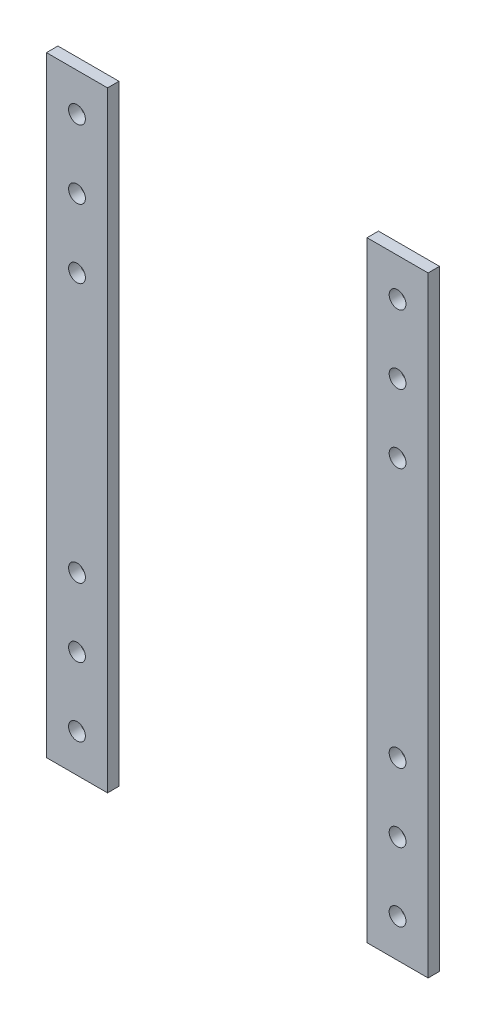
ISO-10303-21;
HEADER;
FILE_DESCRIPTION(('STEP AP214'),'2;1');
FILE_NAME('part.step','',(''),(''),'','','');
FILE_SCHEMA(('AUTOMOTIVE_DESIGN { 1 0 10303 214 1 1 1 1 }'));
ENDSEC;
DATA;
#1=APPLICATION_CONTEXT('core data for automotive mechanical design processes');
#2=APPLICATION_PROTOCOL_DEFINITION('international standard','automotive_design',2000,#1);
#3=PRODUCT_CONTEXT('',#1,'mechanical');
#4=PRODUCT('Part','Part','',(#3));
#5=PRODUCT_RELATED_PRODUCT_CATEGORY('part','',(#4));
#6=PRODUCT_DEFINITION_FORMATION('','',#4);
#7=PRODUCT_DEFINITION_CONTEXT('part definition',#1,'design');
#8=PRODUCT_DEFINITION('design','',#6,#7);
#9=PRODUCT_DEFINITION_SHAPE('','',#8);
#10=(LENGTH_UNIT() NAMED_UNIT(*) SI_UNIT(.MILLI.,.METRE.));
#11=(NAMED_UNIT(*) PLANE_ANGLE_UNIT() SI_UNIT($,.RADIAN.));
#12=(NAMED_UNIT(*) SI_UNIT($,.STERADIAN.) SOLID_ANGLE_UNIT());
#13=UNCERTAINTY_MEASURE_WITH_UNIT(LENGTH_MEASURE(1.E-05),#10,'distance_accuracy_value','');
#14=(GEOMETRIC_REPRESENTATION_CONTEXT(3) GLOBAL_UNCERTAINTY_ASSIGNED_CONTEXT((#13)) GLOBAL_UNIT_ASSIGNED_CONTEXT((#10,
#11,#12)) REPRESENTATION_CONTEXT('',''));
#15=CARTESIAN_POINT('',(0.,0.,0.));
#16=DIRECTION('',(0.,0.,1.));
#17=DIRECTION('',(1.,0.,0.));
#18=AXIS2_PLACEMENT_3D('',#15,#16,#17);
#19=CARTESIAN_POINT('',(0.,0.,-1549.05000079646));
#20=DIRECTION('',(0.,0.,-1.));
#21=DIRECTION('',(-1.,0.,0.));
#22=AXIS2_PLACEMENT_3D('',#19,#20,#21);
#23=PLANE('',#22);
#24=CARTESIAN_POINT('',(42.,860.,-1549.05000079646));
#25=DIRECTION('',(0.,0.,1.));
#26=DIRECTION('',(1.,0.,0.));
#27=AXIS2_PLACEMENT_3D('',#24,#25,#26);
#28=CIRCLE('',#27,2.19999999999996);
#29=CARTESIAN_POINT('',(44.2,860.,-1549.05000079646));
#30=VERTEX_POINT('',#29);
#31=EDGE_CURVE('E367',#30,#30,#28,.T.);
#32=ORIENTED_EDGE('',*,*,#31,.F.);
#33=EDGE_LOOP('',(#32));
#34=FACE_BOUND('',#33,.T.);
#35=CARTESIAN_POINT('',(42.,842.,-1549.05000079646));
#36=DIRECTION('',(0.,0.,1.));
#37=DIRECTION('',(1.,0.,0.));
#38=AXIS2_PLACEMENT_3D('',#35,#36,#37);
#39=CIRCLE('',#38,2.19999999999996);
#40=CARTESIAN_POINT('',(44.2,842.,-1549.05000079646));
#41=VERTEX_POINT('',#40);
#42=EDGE_CURVE('E371',#41,#41,#39,.T.);
#43=ORIENTED_EDGE('',*,*,#42,.F.);
#44=EDGE_LOOP('',(#43));
#45=FACE_BOUND('',#44,.T.);
#46=CARTESIAN_POINT('',(42.,824.,-1549.05000079646));
#47=DIRECTION('',(0.,0.,1.));
#48=DIRECTION('',(1.,0.,0.));
#49=AXIS2_PLACEMENT_3D('',#46,#47,#48);
#50=CIRCLE('',#49,2.19999999999996);
#51=CARTESIAN_POINT('',(44.2,824.,-1549.05000079646));
#52=VERTEX_POINT('',#51);
#53=EDGE_CURVE('E380',#52,#52,#50,.T.);
#54=ORIENTED_EDGE('',*,*,#53,.F.);
#55=EDGE_LOOP('',(#54));
#56=FACE_BOUND('',#55,.T.);
#57=CARTESIAN_POINT('',(42.,756.,-1549.05000079646));
#58=DIRECTION('',(0.,0.,1.));
#59=DIRECTION('',(1.,0.,0.));
#60=AXIS2_PLACEMENT_3D('',#57,#58,#59);
#61=CIRCLE('',#60,2.19999999999996);
#62=CARTESIAN_POINT('',(44.2,756.,-1549.05000079646));
#63=VERTEX_POINT('',#62);
#64=EDGE_CURVE('E386',#63,#63,#61,.T.);
#65=ORIENTED_EDGE('',*,*,#64,.F.);
#66=EDGE_LOOP('',(#65));
#67=FACE_BOUND('',#66,.T.);
#68=CARTESIAN_POINT('',(42.,738.,-1549.05000079646));
#69=DIRECTION('',(0.,0.,1.));
#70=DIRECTION('',(1.,0.,0.));
#71=AXIS2_PLACEMENT_3D('',#68,#69,#70);
#72=CIRCLE('',#71,2.19999999999996);
#73=CARTESIAN_POINT('',(44.2,738.,-1549.05000079646));
#74=VERTEX_POINT('',#73);
#75=EDGE_CURVE('E392',#74,#74,#72,.T.);
#76=ORIENTED_EDGE('',*,*,#75,.F.);
#77=EDGE_LOOP('',(#76));
#78=FACE_BOUND('',#77,.T.);
#79=CARTESIAN_POINT('',(42.,720.,-1549.05000079646));
#80=DIRECTION('',(0.,0.,1.));
#81=DIRECTION('',(1.,0.,0.));
#82=AXIS2_PLACEMENT_3D('',#79,#80,#81);
#83=CIRCLE('',#82,2.19999999999996);
#84=CARTESIAN_POINT('',(44.2,720.,-1549.05000079646));
#85=VERTEX_POINT('',#84);
#86=EDGE_CURVE('E273',#85,#85,#83,.T.);
#87=ORIENTED_EDGE('',*,*,#86,.F.);
#88=EDGE_LOOP('',(#87));
#89=FACE_BOUND('',#88,.T.);
#90=DIRECTION('',(-1.,0.,0.));
#91=VECTOR('',#90,1.);
#92=CARTESIAN_POINT('',(50.,870.,-1549.05000079646));
#93=LINE('',#92,#91);
#94=CARTESIAN_POINT('',(50.,870.,-1549.05000079646));
#95=VERTEX_POINT('',#94);
#96=CARTESIAN_POINT('',(34.,870.,-1549.05000079646));
#97=VERTEX_POINT('',#96);
#98=EDGE_CURVE('E226',#95,#97,#93,.T.);
#99=ORIENTED_EDGE('',*,*,#98,.T.);
#100=DIRECTION('',(0.,-1.,0.));
#101=VECTOR('',#100,1.);
#102=CARTESIAN_POINT('',(34.,870.,-1549.05000079646));
#103=LINE('',#102,#101);
#104=CARTESIAN_POINT('',(34.,710.,-1549.05000079646));
#105=VERTEX_POINT('',#104);
#106=EDGE_CURVE('E283',#97,#105,#103,.T.);
#107=ORIENTED_EDGE('',*,*,#106,.T.);
#108=DIRECTION('',(-1.,0.,0.));
#109=VECTOR('',#108,1.);
#110=CARTESIAN_POINT('',(50.,710.,-1549.05000079646));
#111=LINE('',#110,#109);
#112=CARTESIAN_POINT('',(50.,710.,-1549.05000079646));
#113=VERTEX_POINT('',#112);
#114=EDGE_CURVE('E272',#113,#105,#111,.T.);
#115=ORIENTED_EDGE('',*,*,#114,.F.);
#116=DIRECTION('',(0.,-1.,0.));
#117=VECTOR('',#116,1.);
#118=CARTESIAN_POINT('',(50.,870.,-1549.05000079646));
#119=LINE('',#118,#117);
#120=EDGE_CURVE('E255',#95,#113,#119,.T.);
#121=ORIENTED_EDGE('',*,*,#120,.F.);
#122=EDGE_LOOP('',(#99,#107,#115,#121));
#123=FACE_BOUND('',#122,.T.);
#124=ADVANCED_FACE('F217',(#34,#45,#56,#67,#78,#89,#123),#23,.F.);
#125=CARTESIAN_POINT('',(0.,0.,-1552.05000079646));
#126=DIRECTION('',(0.,0.,-1.));
#127=DIRECTION('',(-1.,0.,0.));
#128=AXIS2_PLACEMENT_3D('',#125,#126,#127);
#129=PLANE('',#128);
#130=CARTESIAN_POINT('',(42.,860.,-1552.05000079646));
#131=DIRECTION('',(0.,0.,1.));
#132=DIRECTION('',(1.,0.,0.));
#133=AXIS2_PLACEMENT_3D('',#130,#131,#132);
#134=CIRCLE('',#133,2.19999999999996);
#135=CARTESIAN_POINT('',(44.2,860.,-1552.05000079646));
#136=VERTEX_POINT('',#135);
#137=EDGE_CURVE('E364',#136,#136,#134,.T.);
#138=ORIENTED_EDGE('',*,*,#137,.T.);
#139=EDGE_LOOP('',(#138));
#140=FACE_BOUND('',#139,.T.);
#141=CARTESIAN_POINT('',(42.,842.,-1552.05000079646));
#142=DIRECTION('',(0.,0.,1.));
#143=DIRECTION('',(1.,0.,0.));
#144=AXIS2_PLACEMENT_3D('',#141,#142,#143);
#145=CIRCLE('',#144,2.19999999999996);
#146=CARTESIAN_POINT('',(44.2,842.,-1552.05000079646));
#147=VERTEX_POINT('',#146);
#148=EDGE_CURVE('E368',#147,#147,#145,.T.);
#149=ORIENTED_EDGE('',*,*,#148,.T.);
#150=EDGE_LOOP('',(#149));
#151=FACE_BOUND('',#150,.T.);
#152=CARTESIAN_POINT('',(42.,824.,-1552.05000079646));
#153=DIRECTION('',(0.,0.,1.));
#154=DIRECTION('',(1.,0.,0.));
#155=AXIS2_PLACEMENT_3D('',#152,#153,#154);
#156=CIRCLE('',#155,2.19999999999996);
#157=CARTESIAN_POINT('',(44.2,824.,-1552.05000079646));
#158=VERTEX_POINT('',#157);
#159=EDGE_CURVE('E377',#158,#158,#156,.T.);
#160=ORIENTED_EDGE('',*,*,#159,.T.);
#161=EDGE_LOOP('',(#160));
#162=FACE_BOUND('',#161,.T.);
#163=CARTESIAN_POINT('',(42.,756.,-1552.05000079646));
#164=DIRECTION('',(0.,0.,1.));
#165=DIRECTION('',(1.,0.,0.));
#166=AXIS2_PLACEMENT_3D('',#163,#164,#165);
#167=CIRCLE('',#166,2.19999999999996);
#168=CARTESIAN_POINT('',(44.2,756.,-1552.05000079646));
#169=VERTEX_POINT('',#168);
#170=EDGE_CURVE('E383',#169,#169,#167,.T.);
#171=ORIENTED_EDGE('',*,*,#170,.T.);
#172=EDGE_LOOP('',(#171));
#173=FACE_BOUND('',#172,.T.);
#174=CARTESIAN_POINT('',(42.,738.,-1552.05000079646));
#175=DIRECTION('',(0.,0.,1.));
#176=DIRECTION('',(1.,0.,0.));
#177=AXIS2_PLACEMENT_3D('',#174,#175,#176);
#178=CIRCLE('',#177,2.19999999999996);
#179=CARTESIAN_POINT('',(44.2,738.,-1552.05000079646));
#180=VERTEX_POINT('',#179);
#181=EDGE_CURVE('E389',#180,#180,#178,.T.);
#182=ORIENTED_EDGE('',*,*,#181,.T.);
#183=EDGE_LOOP('',(#182));
#184=FACE_BOUND('',#183,.T.);
#185=CARTESIAN_POINT('',(42.,720.,-1552.05000079646));
#186=DIRECTION('',(0.,0.,1.));
#187=DIRECTION('',(1.,0.,0.));
#188=AXIS2_PLACEMENT_3D('',#185,#186,#187);
#189=CIRCLE('',#188,2.19999999999996);
#190=CARTESIAN_POINT('',(44.2,720.,-1552.05000079646));
#191=VERTEX_POINT('',#190);
#192=EDGE_CURVE('E276',#191,#191,#189,.T.);
#193=ORIENTED_EDGE('',*,*,#192,.T.);
#194=EDGE_LOOP('',(#193));
#195=FACE_BOUND('',#194,.T.);
#196=DIRECTION('',(-1.,0.,0.));
#197=VECTOR('',#196,1.);
#198=CARTESIAN_POINT('',(50.,870.,-1552.05000079646));
#199=LINE('',#198,#197);
#200=CARTESIAN_POINT('',(50.,870.,-1552.05000079646));
#201=VERTEX_POINT('',#200);
#202=CARTESIAN_POINT('',(34.,870.,-1552.05000079646));
#203=VERTEX_POINT('',#202);
#204=EDGE_CURVE('E13',#201,#203,#199,.T.);
#205=ORIENTED_EDGE('',*,*,#204,.F.);
#206=DIRECTION('',(0.,-1.,0.));
#207=VECTOR('',#206,1.);
#208=CARTESIAN_POINT('',(50.,870.,-1552.05000079646));
#209=LINE('',#208,#207);
#210=CARTESIAN_POINT('',(50.,710.,-1552.05000079646));
#211=VERTEX_POINT('',#210);
#212=EDGE_CURVE('E269',#201,#211,#209,.T.);
#213=ORIENTED_EDGE('',*,*,#212,.T.);
#214=DIRECTION('',(-1.,0.,0.));
#215=VECTOR('',#214,1.);
#216=CARTESIAN_POINT('',(50.,710.,-1552.05000079646));
#217=LINE('',#216,#215);
#218=CARTESIAN_POINT('',(34.,710.,-1552.05000079646));
#219=VERTEX_POINT('',#218);
#220=EDGE_CURVE('E290',#211,#219,#217,.T.);
#221=ORIENTED_EDGE('',*,*,#220,.T.);
#222=DIRECTION('',(0.,-1.,0.));
#223=VECTOR('',#222,1.);
#224=CARTESIAN_POINT('',(34.,870.,-1552.05000079646));
#225=LINE('',#224,#223);
#226=EDGE_CURVE('E265',#203,#219,#225,.T.);
#227=ORIENTED_EDGE('',*,*,#226,.F.);
#228=EDGE_LOOP('',(#205,#213,#221,#227));
#229=FACE_BOUND('',#228,.T.);
#230=ADVANCED_FACE('F317',(#140,#151,#162,#173,#184,#195,#229),#129,.T.);
#231=CARTESIAN_POINT('',(50.,870.,-1552.05000079646));
#232=DIRECTION('',(-1.,0.,0.));
#233=DIRECTION('',(0.,0.,1.));
#234=AXIS2_PLACEMENT_3D('',#231,#232,#233);
#235=PLANE('',#234);
#236=ORIENTED_EDGE('',*,*,#120,.T.);
#237=DIRECTION('',(0.,0.,1.));
#238=VECTOR('',#237,1.);
#239=CARTESIAN_POINT('',(50.,710.,-1552.05000079646));
#240=LINE('',#239,#238);
#241=EDGE_CURVE('E298',#211,#113,#240,.T.);
#242=ORIENTED_EDGE('',*,*,#241,.F.);
#243=ORIENTED_EDGE('',*,*,#212,.F.);
#244=DIRECTION('',(0.,0.,1.));
#245=VECTOR('',#244,1.);
#246=CARTESIAN_POINT('',(50.,870.,-1552.05000079646));
#247=LINE('',#246,#245);
#248=EDGE_CURVE('E260',#201,#95,#247,.T.);
#249=ORIENTED_EDGE('',*,*,#248,.T.);
#250=EDGE_LOOP('',(#236,#242,#243,#249));
#251=FACE_BOUND('',#250,.T.);
#252=ADVANCED_FACE('F267',(#251),#235,.F.);
#253=CARTESIAN_POINT('',(50.,710.,-1552.05000079646));
#254=DIRECTION('',(0.,1.,0.));
#255=DIRECTION('',(0.,0.,1.));
#256=AXIS2_PLACEMENT_3D('',#253,#254,#255);
#257=PLANE('',#256);
#258=ORIENTED_EDGE('',*,*,#114,.T.);
#259=DIRECTION('',(0.,0.,1.));
#260=VECTOR('',#259,1.);
#261=CARTESIAN_POINT('',(34.,710.,-1552.05000079646));
#262=LINE('',#261,#260);
#263=EDGE_CURVE('E285',#219,#105,#262,.T.);
#264=ORIENTED_EDGE('',*,*,#263,.F.);
#265=ORIENTED_EDGE('',*,*,#220,.F.);
#266=ORIENTED_EDGE('',*,*,#241,.T.);
#267=EDGE_LOOP('',(#258,#264,#265,#266));
#268=FACE_BOUND('',#267,.T.);
#269=ADVANCED_FACE('F316',(#268),#257,.F.);
#270=CARTESIAN_POINT('',(50.,870.,-1552.05000079646));
#271=DIRECTION('',(0.,1.,0.));
#272=DIRECTION('',(0.,0.,1.));
#273=AXIS2_PLACEMENT_3D('',#270,#271,#272);
#274=PLANE('',#273);
#275=ORIENTED_EDGE('',*,*,#98,.F.);
#276=ORIENTED_EDGE('',*,*,#248,.F.);
#277=ORIENTED_EDGE('',*,*,#204,.T.);
#278=DIRECTION('',(0.,0.,1.));
#279=VECTOR('',#278,1.);
#280=CARTESIAN_POINT('',(34.,870.,-1552.05000079646));
#281=LINE('',#280,#279);
#282=EDGE_CURVE('E262',#203,#97,#281,.T.);
#283=ORIENTED_EDGE('',*,*,#282,.T.);
#284=EDGE_LOOP('',(#275,#276,#277,#283));
#285=FACE_BOUND('',#284,.T.);
#286=ADVANCED_FACE('F259',(#285),#274,.T.);
#287=CARTESIAN_POINT('',(34.,870.,-1552.05000079646));
#288=DIRECTION('',(-1.,0.,0.));
#289=DIRECTION('',(0.,-1.,0.));
#290=AXIS2_PLACEMENT_3D('',#287,#288,#289);
#291=PLANE('',#290);
#292=ORIENTED_EDGE('',*,*,#106,.F.);
#293=ORIENTED_EDGE('',*,*,#282,.F.);
#294=ORIENTED_EDGE('',*,*,#226,.T.);
#295=ORIENTED_EDGE('',*,*,#263,.T.);
#296=EDGE_LOOP('',(#292,#293,#294,#295));
#297=FACE_BOUND('',#296,.T.);
#298=ADVANCED_FACE('F315',(#297),#291,.T.);
#299=CARTESIAN_POINT('',(42.,720.,-1552.05000079646));
#300=DIRECTION('',(0.,0.,1.));
#301=DIRECTION('',(1.,0.,0.));
#302=AXIS2_PLACEMENT_3D('',#299,#300,#301);
#303=CYLINDRICAL_SURFACE('',#302,2.19999999999996);
#304=ORIENTED_EDGE('',*,*,#192,.F.);
#305=EDGE_LOOP('',(#304));
#306=FACE_BOUND('',#305,.T.);
#307=ORIENTED_EDGE('',*,*,#86,.T.);
#308=EDGE_LOOP('',(#307));
#309=FACE_BOUND('',#308,.T.);
#310=ADVANCED_FACE('F326',(#306,#309),#303,.F.);
#311=CARTESIAN_POINT('',(42.,738.,-1552.05000079646));
#312=DIRECTION('',(0.,0.,1.));
#313=DIRECTION('',(1.,0.,0.));
#314=AXIS2_PLACEMENT_3D('',#311,#312,#313);
#315=CYLINDRICAL_SURFACE('',#314,2.19999999999996);
#316=ORIENTED_EDGE('',*,*,#181,.F.);
#317=EDGE_LOOP('',(#316));
#318=FACE_BOUND('',#317,.T.);
#319=ORIENTED_EDGE('',*,*,#75,.T.);
#320=EDGE_LOOP('',(#319));
#321=FACE_BOUND('',#320,.T.);
#322=ADVANCED_FACE('F336',(#318,#321),#315,.F.);
#323=CARTESIAN_POINT('',(42.,756.,-1552.05000079646));
#324=DIRECTION('',(0.,0.,1.));
#325=DIRECTION('',(1.,0.,0.));
#326=AXIS2_PLACEMENT_3D('',#323,#324,#325);
#327=CYLINDRICAL_SURFACE('',#326,2.19999999999996);
#328=ORIENTED_EDGE('',*,*,#170,.F.);
#329=EDGE_LOOP('',(#328));
#330=FACE_BOUND('',#329,.T.);
#331=ORIENTED_EDGE('',*,*,#64,.T.);
#332=EDGE_LOOP('',(#331));
#333=FACE_BOUND('',#332,.T.);
#334=ADVANCED_FACE('F344',(#330,#333),#327,.F.);
#335=CARTESIAN_POINT('',(42.,824.,-1552.05000079646));
#336=DIRECTION('',(0.,0.,1.));
#337=DIRECTION('',(1.,0.,0.));
#338=AXIS2_PLACEMENT_3D('',#335,#336,#337);
#339=CYLINDRICAL_SURFACE('',#338,2.19999999999996);
#340=ORIENTED_EDGE('',*,*,#159,.F.);
#341=EDGE_LOOP('',(#340));
#342=FACE_BOUND('',#341,.T.);
#343=ORIENTED_EDGE('',*,*,#53,.T.);
#344=EDGE_LOOP('',(#343));
#345=FACE_BOUND('',#344,.T.);
#346=ADVANCED_FACE('F348',(#342,#345),#339,.F.);
#347=CARTESIAN_POINT('',(42.,842.,-1552.05000079646));
#348=DIRECTION('',(0.,0.,1.));
#349=DIRECTION('',(1.,0.,0.));
#350=AXIS2_PLACEMENT_3D('',#347,#348,#349);
#351=CYLINDRICAL_SURFACE('',#350,2.19999999999996);
#352=ORIENTED_EDGE('',*,*,#148,.F.);
#353=EDGE_LOOP('',(#352));
#354=FACE_BOUND('',#353,.T.);
#355=ORIENTED_EDGE('',*,*,#42,.T.);
#356=EDGE_LOOP('',(#355));
#357=FACE_BOUND('',#356,.T.);
#358=ADVANCED_FACE('F352',(#354,#357),#351,.F.);
#359=CARTESIAN_POINT('',(42.,860.,-1552.05000079646));
#360=DIRECTION('',(0.,0.,1.));
#361=DIRECTION('',(1.,0.,0.));
#362=AXIS2_PLACEMENT_3D('',#359,#360,#361);
#363=CYLINDRICAL_SURFACE('',#362,2.19999999999996);
#364=ORIENTED_EDGE('',*,*,#137,.F.);
#365=EDGE_LOOP('',(#364));
#366=FACE_BOUND('',#365,.T.);
#367=ORIENTED_EDGE('',*,*,#31,.T.);
#368=EDGE_LOOP('',(#367));
#369=FACE_BOUND('',#368,.T.);
#370=ADVANCED_FACE('F356',(#366,#369),#363,.F.);
#371=CLOSED_SHELL('',(#124,#230,#252,#269,#286,#298,#310,#322,#334,#346,#358,#370));
#372=MANIFOLD_SOLID_BREP('B2',#371);
#373=CARTESIAN_POINT('',(0.,0.,-1549.05000079646));
#374=DIRECTION('',(0.,0.,-1.));
#375=DIRECTION('',(-1.,0.,0.));
#376=AXIS2_PLACEMENT_3D('',#373,#374,#375);
#377=PLANE('',#376);
#378=CARTESIAN_POINT('',(-42.,720.,-1549.05000079646));
#379=DIRECTION('',(0.,0.,1.));
#380=DIRECTION('',(1.,0.,0.));
#381=AXIS2_PLACEMENT_3D('',#378,#379,#380);
#382=CIRCLE('',#381,2.19999999999996);
#383=CARTESIAN_POINT('',(-39.8000000000001,720.,-1549.05000079646));
#384=VERTEX_POINT('',#383);
#385=EDGE_CURVE('E618',#384,#384,#382,.T.);
#386=ORIENTED_EDGE('',*,*,#385,.F.);
#387=EDGE_LOOP('',(#386));
#388=FACE_BOUND('',#387,.T.);
#389=CARTESIAN_POINT('',(-42.,738.,-1549.05000079646));
#390=DIRECTION('',(0.,0.,1.));
#391=DIRECTION('',(1.,0.,0.));
#392=AXIS2_PLACEMENT_3D('',#389,#390,#391);
#393=CIRCLE('',#392,2.19999999999996);
#394=CARTESIAN_POINT('',(-39.8000000000001,738.,-1549.05000079646));
#395=VERTEX_POINT('',#394);
#396=EDGE_CURVE('E612',#395,#395,#393,.T.);
#397=ORIENTED_EDGE('',*,*,#396,.F.);
#398=EDGE_LOOP('',(#397));
#399=FACE_BOUND('',#398,.T.);
#400=CARTESIAN_POINT('',(-42.,756.,-1549.05000079646));
#401=DIRECTION('',(0.,0.,1.));
#402=DIRECTION('',(1.,0.,0.));
#403=AXIS2_PLACEMENT_3D('',#400,#401,#402);
#404=CIRCLE('',#403,2.19999999999996);
#405=CARTESIAN_POINT('',(-39.8000000000001,756.,-1549.05000079646));
#406=VERTEX_POINT('',#405);
#407=EDGE_CURVE('E606',#406,#406,#404,.T.);
#408=ORIENTED_EDGE('',*,*,#407,.F.);
#409=EDGE_LOOP('',(#408));
#410=FACE_BOUND('',#409,.T.);
#411=CARTESIAN_POINT('',(-42.,824.,-1549.05000079646));
#412=DIRECTION('',(0.,0.,1.));
#413=DIRECTION('',(1.,0.,0.));
#414=AXIS2_PLACEMENT_3D('',#411,#412,#413);
#415=CIRCLE('',#414,2.19999999999996);
#416=CARTESIAN_POINT('',(-39.8000000000001,824.,-1549.05000079646));
#417=VERTEX_POINT('',#416);
#418=EDGE_CURVE('E600',#417,#417,#415,.T.);
#419=ORIENTED_EDGE('',*,*,#418,.F.);
#420=EDGE_LOOP('',(#419));
#421=FACE_BOUND('',#420,.T.);
#422=CARTESIAN_POINT('',(-42.,842.,-1549.05000079646));
#423=DIRECTION('',(0.,0.,1.));
#424=DIRECTION('',(1.,0.,0.));
#425=AXIS2_PLACEMENT_3D('',#422,#423,#424);
#426=CIRCLE('',#425,2.19999999999996);
#427=CARTESIAN_POINT('',(-39.8000000000001,842.,-1549.05000079646));
#428=VERTEX_POINT('',#427);
#429=EDGE_CURVE('E594',#428,#428,#426,.T.);
#430=ORIENTED_EDGE('',*,*,#429,.F.);
#431=EDGE_LOOP('',(#430));
#432=FACE_BOUND('',#431,.T.);
#433=CARTESIAN_POINT('',(-42.,860.,-1549.05000079646));
#434=DIRECTION('',(0.,0.,1.));
#435=DIRECTION('',(1.,0.,0.));
#436=AXIS2_PLACEMENT_3D('',#433,#434,#435);
#437=CIRCLE('',#436,2.19999999999996);
#438=CARTESIAN_POINT('',(-39.8000000000001,860.,-1549.05000079646));
#439=VERTEX_POINT('',#438);
#440=EDGE_CURVE('E563',#439,#439,#437,.T.);
#441=ORIENTED_EDGE('',*,*,#440,.F.);
#442=EDGE_LOOP('',(#441));
#443=FACE_BOUND('',#442,.T.);
#444=DIRECTION('',(0.,-1.,0.));
#445=VECTOR('',#444,1.);
#446=CARTESIAN_POINT('',(-50.,870.,-1549.05000079646));
#447=LINE('',#446,#445);
#448=CARTESIAN_POINT('',(-50.,870.,-1549.05000079646));
#449=VERTEX_POINT('',#448);
#450=CARTESIAN_POINT('',(-50.,710.,-1549.05000079646));
#451=VERTEX_POINT('',#450);
#452=EDGE_CURVE('E520',#449,#451,#447,.T.);
#453=ORIENTED_EDGE('',*,*,#452,.T.);
#454=DIRECTION('',(1.,0.,0.));
#455=VECTOR('',#454,1.);
#456=CARTESIAN_POINT('',(-50.,710.,-1549.05000079646));
#457=LINE('',#456,#455);
#458=CARTESIAN_POINT('',(-34.,710.,-1549.05000079646));
#459=VERTEX_POINT('',#458);
#460=EDGE_CURVE('E526',#451,#459,#457,.T.);
#461=ORIENTED_EDGE('',*,*,#460,.T.);
#462=DIRECTION('',(0.,-1.,0.));
#463=VECTOR('',#462,1.);
#464=CARTESIAN_POINT('',(-34.,870.,-1549.05000079646));
#465=LINE('',#464,#463);
#466=CARTESIAN_POINT('',(-34.,870.,-1549.05000079646));
#467=VERTEX_POINT('',#466);
#468=EDGE_CURVE('E550',#467,#459,#465,.T.);
#469=ORIENTED_EDGE('',*,*,#468,.F.);
#470=DIRECTION('',(1.,0.,0.));
#471=VECTOR('',#470,1.);
#472=CARTESIAN_POINT('',(-50.,870.,-1549.05000079646));
#473=LINE('',#472,#471);
#474=EDGE_CURVE('E500',#449,#467,#473,.T.);
#475=ORIENTED_EDGE('',*,*,#474,.F.);
#476=EDGE_LOOP('',(#453,#461,#469,#475));
#477=FACE_BOUND('',#476,.T.);
#478=ADVANCED_FACE('F491',(#388,#399,#410,#421,#432,#443,#477),#377,.F.);
#479=CARTESIAN_POINT('',(0.,0.,-1552.05000079646));
#480=DIRECTION('',(0.,0.,-1.));
#481=DIRECTION('',(-1.,0.,0.));
#482=AXIS2_PLACEMENT_3D('',#479,#480,#481);
#483=PLANE('',#482);
#484=CARTESIAN_POINT('',(-42.,720.,-1552.05000079646));
#485=DIRECTION('',(0.,0.,1.));
#486=DIRECTION('',(1.,0.,0.));
#487=AXIS2_PLACEMENT_3D('',#484,#485,#486);
#488=CIRCLE('',#487,2.19999999999996);
#489=CARTESIAN_POINT('',(-39.8000000000001,720.,-1552.05000079646));
#490=VERTEX_POINT('',#489);
#491=EDGE_CURVE('E621',#490,#490,#488,.T.);
#492=ORIENTED_EDGE('',*,*,#491,.T.);
#493=EDGE_LOOP('',(#492));
#494=FACE_BOUND('',#493,.T.);
#495=CARTESIAN_POINT('',(-42.,738.,-1552.05000079646));
#496=DIRECTION('',(0.,0.,1.));
#497=DIRECTION('',(1.,0.,0.));
#498=AXIS2_PLACEMENT_3D('',#495,#496,#497);
#499=CIRCLE('',#498,2.19999999999996);
#500=CARTESIAN_POINT('',(-39.8000000000001,738.,-1552.05000079646));
#501=VERTEX_POINT('',#500);
#502=EDGE_CURVE('E615',#501,#501,#499,.T.);
#503=ORIENTED_EDGE('',*,*,#502,.T.);
#504=EDGE_LOOP('',(#503));
#505=FACE_BOUND('',#504,.T.);
#506=CARTESIAN_POINT('',(-42.,756.,-1552.05000079646));
#507=DIRECTION('',(0.,0.,1.));
#508=DIRECTION('',(1.,0.,0.));
#509=AXIS2_PLACEMENT_3D('',#506,#507,#508);
#510=CIRCLE('',#509,2.19999999999996);
#511=CARTESIAN_POINT('',(-39.8000000000001,756.,-1552.05000079646));
#512=VERTEX_POINT('',#511);
#513=EDGE_CURVE('E609',#512,#512,#510,.T.);
#514=ORIENTED_EDGE('',*,*,#513,.T.);
#515=EDGE_LOOP('',(#514));
#516=FACE_BOUND('',#515,.T.);
#517=CARTESIAN_POINT('',(-42.,824.,-1552.05000079646));
#518=DIRECTION('',(0.,0.,1.));
#519=DIRECTION('',(1.,0.,0.));
#520=AXIS2_PLACEMENT_3D('',#517,#518,#519);
#521=CIRCLE('',#520,2.19999999999996);
#522=CARTESIAN_POINT('',(-39.8000000000001,824.,-1552.05000079646));
#523=VERTEX_POINT('',#522);
#524=EDGE_CURVE('E603',#523,#523,#521,.T.);
#525=ORIENTED_EDGE('',*,*,#524,.T.);
#526=EDGE_LOOP('',(#525));
#527=FACE_BOUND('',#526,.T.);
#528=CARTESIAN_POINT('',(-42.,842.,-1552.05000079646));
#529=DIRECTION('',(0.,0.,1.));
#530=DIRECTION('',(1.,0.,0.));
#531=AXIS2_PLACEMENT_3D('',#528,#529,#530);
#532=CIRCLE('',#531,2.19999999999996);
#533=CARTESIAN_POINT('',(-39.8000000000001,842.,-1552.05000079646));
#534=VERTEX_POINT('',#533);
#535=EDGE_CURVE('E597',#534,#534,#532,.T.);
#536=ORIENTED_EDGE('',*,*,#535,.T.);
#537=EDGE_LOOP('',(#536));
#538=FACE_BOUND('',#537,.T.);
#539=CARTESIAN_POINT('',(-42.,860.,-1552.05000079646));
#540=DIRECTION('',(0.,0.,1.));
#541=DIRECTION('',(1.,0.,0.));
#542=AXIS2_PLACEMENT_3D('',#539,#540,#541);
#543=CIRCLE('',#542,2.19999999999996);
#544=CARTESIAN_POINT('',(-39.8000000000001,860.,-1552.05000079646));
#545=VERTEX_POINT('',#544);
#546=EDGE_CURVE('E591',#545,#545,#543,.T.);
#547=ORIENTED_EDGE('',*,*,#546,.T.);
#548=EDGE_LOOP('',(#547));
#549=FACE_BOUND('',#548,.T.);
#550=DIRECTION('',(0.,-1.,0.));
#551=VECTOR('',#550,1.);
#552=CARTESIAN_POINT('',(-50.,870.,-1552.05000079646));
#553=LINE('',#552,#551);
#554=CARTESIAN_POINT('',(-50.,870.,-1552.05000079646));
#555=VERTEX_POINT('',#554);
#556=CARTESIAN_POINT('',(-50.,710.,-1552.05000079646));
#557=VERTEX_POINT('',#556);
#558=EDGE_CURVE('E508',#555,#557,#553,.T.);
#559=ORIENTED_EDGE('',*,*,#558,.F.);
#560=DIRECTION('',(1.,0.,0.));
#561=VECTOR('',#560,1.);
#562=CARTESIAN_POINT('',(-50.,870.,-1552.05000079646));
#563=LINE('',#562,#561);
#564=CARTESIAN_POINT('',(-34.,870.,-1552.05000079646));
#565=VERTEX_POINT('',#564);
#566=EDGE_CURVE('E215',#555,#565,#563,.T.);
#567=ORIENTED_EDGE('',*,*,#566,.T.);
#568=DIRECTION('',(0.,-1.,0.));
#569=VECTOR('',#568,1.);
#570=CARTESIAN_POINT('',(-34.,870.,-1552.05000079646));
#571=LINE('',#570,#569);
#572=CARTESIAN_POINT('',(-34.,710.,-1552.05000079646));
#573=VERTEX_POINT('',#572);
#574=EDGE_CURVE('E535',#565,#573,#571,.T.);
#575=ORIENTED_EDGE('',*,*,#574,.T.);
#576=DIRECTION('',(1.,0.,0.));
#577=VECTOR('',#576,1.);
#578=CARTESIAN_POINT('',(-50.,710.,-1552.05000079646));
#579=LINE('',#578,#577);
#580=EDGE_CURVE('E569',#557,#573,#579,.T.);
#581=ORIENTED_EDGE('',*,*,#580,.F.);
#582=EDGE_LOOP('',(#559,#567,#575,#581));
#583=FACE_BOUND('',#582,.T.);
#584=ADVANCED_FACE('F534',(#494,#505,#516,#527,#538,#549,#583),#483,.T.);
#585=CARTESIAN_POINT('',(-50.,870.,-1552.05000079646));
#586=DIRECTION('',(-1.,0.,0.));
#587=DIRECTION('',(0.,0.,1.));
#588=AXIS2_PLACEMENT_3D('',#585,#586,#587);
#589=PLANE('',#588);
#590=ORIENTED_EDGE('',*,*,#452,.F.);
#591=DIRECTION('',(0.,0.,1.));
#592=VECTOR('',#591,1.);
#593=CARTESIAN_POINT('',(-50.,870.,-1552.05000079646));
#594=LINE('',#593,#592);
#595=EDGE_CURVE('E562',#555,#449,#594,.T.);
#596=ORIENTED_EDGE('',*,*,#595,.F.);
#597=ORIENTED_EDGE('',*,*,#558,.T.);
#598=DIRECTION('',(0.,0.,1.));
#599=VECTOR('',#598,1.);
#600=CARTESIAN_POINT('',(-50.,710.,-1552.05000079646));
#601=LINE('',#600,#599);
#602=EDGE_CURVE('E576',#557,#451,#601,.T.);
#603=ORIENTED_EDGE('',*,*,#602,.T.);
#604=EDGE_LOOP('',(#590,#596,#597,#603));
#605=FACE_BOUND('',#604,.T.);
#606=ADVANCED_FACE('F662',(#605),#589,.T.);
#607=CARTESIAN_POINT('',(-50.,710.,-1552.05000079646));
#608=DIRECTION('',(0.,-1.,0.));
#609=DIRECTION('',(0.,0.,-1.));
#610=AXIS2_PLACEMENT_3D('',#607,#608,#609);
#611=PLANE('',#610);
#612=ORIENTED_EDGE('',*,*,#460,.F.);
#613=ORIENTED_EDGE('',*,*,#602,.F.);
#614=ORIENTED_EDGE('',*,*,#580,.T.);
#615=DIRECTION('',(0.,0.,1.));
#616=VECTOR('',#615,1.);
#617=CARTESIAN_POINT('',(-34.,710.,-1552.05000079646));
#618=LINE('',#617,#616);
#619=EDGE_CURVE('E546',#573,#459,#618,.T.);
#620=ORIENTED_EDGE('',*,*,#619,.T.);
#621=EDGE_LOOP('',(#612,#613,#614,#620));
#622=FACE_BOUND('',#621,.T.);
#623=ADVANCED_FACE('F665',(#622),#611,.T.);
#624=CARTESIAN_POINT('',(-50.,870.,-1552.05000079646));
#625=DIRECTION('',(0.,-1.,0.));
#626=DIRECTION('',(0.,0.,-1.));
#627=AXIS2_PLACEMENT_3D('',#624,#625,#626);
#628=PLANE('',#627);
#629=ORIENTED_EDGE('',*,*,#474,.T.);
#630=DIRECTION('',(0.,0.,1.));
#631=VECTOR('',#630,1.);
#632=CARTESIAN_POINT('',(-34.,870.,-1552.05000079646));
#633=LINE('',#632,#631);
#634=EDGE_CURVE('E544',#565,#467,#633,.T.);
#635=ORIENTED_EDGE('',*,*,#634,.F.);
#636=ORIENTED_EDGE('',*,*,#566,.F.);
#637=ORIENTED_EDGE('',*,*,#595,.T.);
#638=EDGE_LOOP('',(#629,#635,#636,#637));
#639=FACE_BOUND('',#638,.T.);
#640=ADVANCED_FACE('F549',(#639),#628,.F.);
#641=CARTESIAN_POINT('',(-34.,870.,-1552.05000079646));
#642=DIRECTION('',(-1.,0.,0.));
#643=DIRECTION('',(0.,-1.,0.));
#644=AXIS2_PLACEMENT_3D('',#641,#642,#643);
#645=PLANE('',#644);
#646=ORIENTED_EDGE('',*,*,#468,.T.);
#647=ORIENTED_EDGE('',*,*,#619,.F.);
#648=ORIENTED_EDGE('',*,*,#574,.F.);
#649=ORIENTED_EDGE('',*,*,#634,.T.);
#650=EDGE_LOOP('',(#646,#647,#648,#649));
#651=FACE_BOUND('',#650,.T.);
#652=ADVANCED_FACE('F543',(#651),#645,.F.);
#653=CARTESIAN_POINT('',(-42.,860.,-1552.05000079646));
#654=DIRECTION('',(0.,0.,1.));
#655=DIRECTION('',(1.,0.,0.));
#656=AXIS2_PLACEMENT_3D('',#653,#654,#655);
#657=CYLINDRICAL_SURFACE('',#656,2.19999999999996);
#658=ORIENTED_EDGE('',*,*,#546,.F.);
#659=EDGE_LOOP('',(#658));
#660=FACE_BOUND('',#659,.T.);
#661=ORIENTED_EDGE('',*,*,#440,.T.);
#662=EDGE_LOOP('',(#661));
#663=FACE_BOUND('',#662,.T.);
#664=ADVANCED_FACE('F636',(#660,#663),#657,.F.);
#665=CARTESIAN_POINT('',(-42.,842.,-1552.05000079646));
#666=DIRECTION('',(0.,0.,1.));
#667=DIRECTION('',(1.,0.,0.));
#668=AXIS2_PLACEMENT_3D('',#665,#666,#667);
#669=CYLINDRICAL_SURFACE('',#668,2.19999999999996);
#670=ORIENTED_EDGE('',*,*,#535,.F.);
#671=EDGE_LOOP('',(#670));
#672=FACE_BOUND('',#671,.T.);
#673=ORIENTED_EDGE('',*,*,#429,.T.);
#674=EDGE_LOOP('',(#673));
#675=FACE_BOUND('',#674,.T.);
#676=ADVANCED_FACE('F648',(#672,#675),#669,.F.);
#677=CARTESIAN_POINT('',(-42.,824.,-1552.05000079646));
#678=DIRECTION('',(0.,0.,1.));
#679=DIRECTION('',(1.,0.,0.));
#680=AXIS2_PLACEMENT_3D('',#677,#678,#679);
#681=CYLINDRICAL_SURFACE('',#680,2.19999999999996);
#682=ORIENTED_EDGE('',*,*,#524,.F.);
#683=EDGE_LOOP('',(#682));
#684=FACE_BOUND('',#683,.T.);
#685=ORIENTED_EDGE('',*,*,#418,.T.);
#686=EDGE_LOOP('',(#685));
#687=FACE_BOUND('',#686,.T.);
#688=ADVANCED_FACE('F655',(#684,#687),#681,.F.);
#689=CARTESIAN_POINT('',(-42.,756.,-1552.05000079646));
#690=DIRECTION('',(0.,0.,1.));
#691=DIRECTION('',(1.,0.,0.));
#692=AXIS2_PLACEMENT_3D('',#689,#690,#691);
#693=CYLINDRICAL_SURFACE('',#692,2.19999999999996);
#694=ORIENTED_EDGE('',*,*,#513,.F.);
#695=EDGE_LOOP('',(#694));
#696=FACE_BOUND('',#695,.T.);
#697=ORIENTED_EDGE('',*,*,#407,.T.);
#698=EDGE_LOOP('',(#697));
#699=FACE_BOUND('',#698,.T.);
#700=ADVANCED_FACE('F710',(#696,#699),#693,.F.);
#701=CARTESIAN_POINT('',(-42.,738.,-1552.05000079646));
#702=DIRECTION('',(0.,0.,1.));
#703=DIRECTION('',(1.,0.,0.));
#704=AXIS2_PLACEMENT_3D('',#701,#702,#703);
#705=CYLINDRICAL_SURFACE('',#704,2.19999999999996);
#706=ORIENTED_EDGE('',*,*,#502,.F.);
#707=EDGE_LOOP('',(#706));
#708=FACE_BOUND('',#707,.T.);
#709=ORIENTED_EDGE('',*,*,#396,.T.);
#710=EDGE_LOOP('',(#709));
#711=FACE_BOUND('',#710,.T.);
#712=ADVANCED_FACE('F630',(#708,#711),#705,.F.);
#713=CARTESIAN_POINT('',(-42.,720.,-1552.05000079646));
#714=DIRECTION('',(0.,0.,1.));
#715=DIRECTION('',(1.,0.,0.));
#716=AXIS2_PLACEMENT_3D('',#713,#714,#715);
#717=CYLINDRICAL_SURFACE('',#716,2.19999999999996);
#718=ORIENTED_EDGE('',*,*,#491,.F.);
#719=EDGE_LOOP('',(#718));
#720=FACE_BOUND('',#719,.T.);
#721=ORIENTED_EDGE('',*,*,#385,.T.);
#722=EDGE_LOOP('',(#721));
#723=FACE_BOUND('',#722,.T.);
#724=ADVANCED_FACE('F627',(#720,#723),#717,.F.);
#725=CLOSED_SHELL('',(#478,#584,#606,#623,#640,#652,#664,#676,#688,#700,#712,#724));
#726=MANIFOLD_SOLID_BREP('B7',#725);
#727=ADVANCED_BREP_SHAPE_REPRESENTATION('',(#18,#372,#726),#14);
#728=SHAPE_DEFINITION_REPRESENTATION(#9,#727);
ENDSEC;
END-ISO-10303-21;
